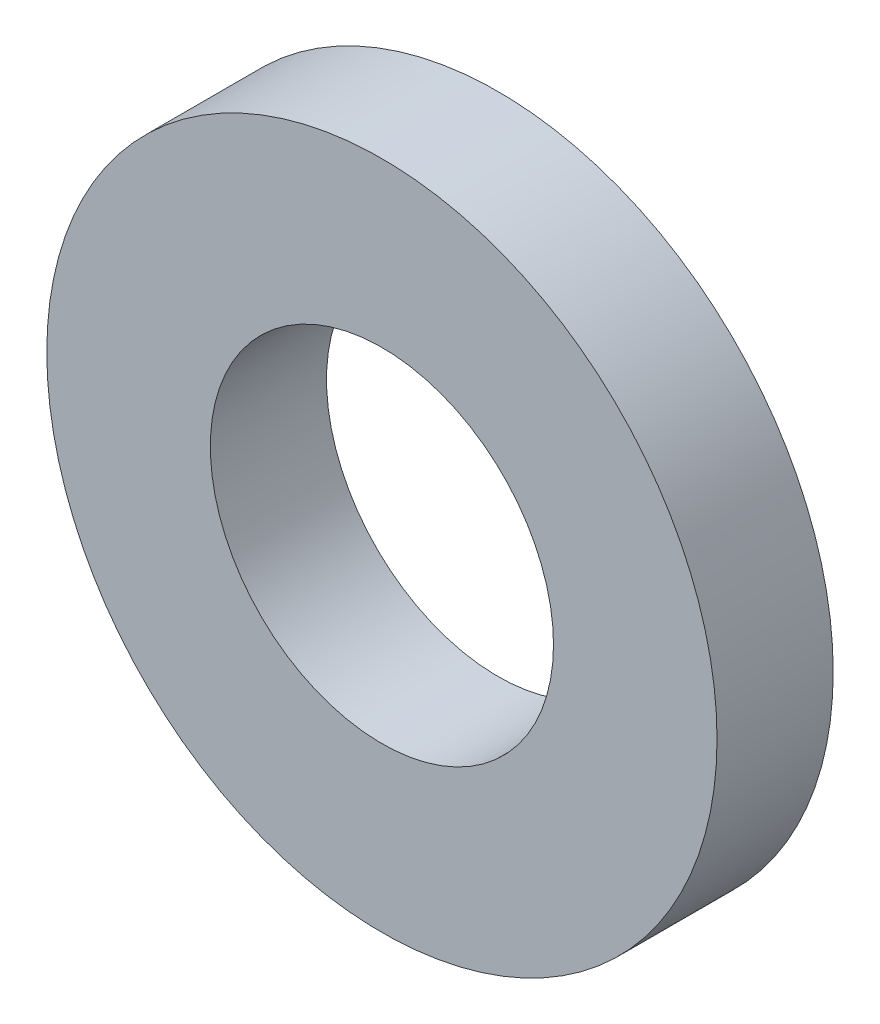
ISO-10303-21;
HEADER;
FILE_DESCRIPTION(('STEP AP214'),'2;1');
FILE_NAME('part.step','',(''),(''),'','','');
FILE_SCHEMA(('AUTOMOTIVE_DESIGN { 1 0 10303 214 1 1 1 1 }'));
ENDSEC;
DATA;
#1=APPLICATION_CONTEXT('core data for automotive mechanical design processes');
#2=APPLICATION_PROTOCOL_DEFINITION('international standard','automotive_design',2000,#1);
#3=PRODUCT_CONTEXT('',#1,'mechanical');
#4=PRODUCT('Part','Part','',(#3));
#5=PRODUCT_RELATED_PRODUCT_CATEGORY('part','',(#4));
#6=PRODUCT_DEFINITION_FORMATION('','',#4);
#7=PRODUCT_DEFINITION_CONTEXT('part definition',#1,'design');
#8=PRODUCT_DEFINITION('design','',#6,#7);
#9=PRODUCT_DEFINITION_SHAPE('','',#8);
#10=(LENGTH_UNIT() NAMED_UNIT(*) SI_UNIT(.MILLI.,.METRE.));
#11=(NAMED_UNIT(*) PLANE_ANGLE_UNIT() SI_UNIT($,.RADIAN.));
#12=(NAMED_UNIT(*) SI_UNIT($,.STERADIAN.) SOLID_ANGLE_UNIT());
#13=UNCERTAINTY_MEASURE_WITH_UNIT(LENGTH_MEASURE(1.E-05),#10,'distance_accuracy_value','');
#14=(GEOMETRIC_REPRESENTATION_CONTEXT(3) GLOBAL_UNCERTAINTY_ASSIGNED_CONTEXT((#13)) GLOBAL_UNIT_ASSIGNED_CONTEXT((#10,
#11,#12)) REPRESENTATION_CONTEXT('',''));
#15=CARTESIAN_POINT('',(0.,0.,0.));
#16=DIRECTION('',(0.,0.,1.));
#17=DIRECTION('',(1.,0.,0.));
#18=AXIS2_PLACEMENT_3D('',#15,#16,#17);
#19=CARTESIAN_POINT('',(0.,0.,-1.651));
#20=DIRECTION('',(0.,0.,1.));
#21=DIRECTION('',(1.,0.,0.));
#22=AXIS2_PLACEMENT_3D('',#19,#20,#21);
#23=CYLINDRICAL_SURFACE('',#22,4.7625);
#24=CARTESIAN_POINT('',(0.,0.,-1.651));
#25=DIRECTION('',(0.,0.,1.));
#26=DIRECTION('',(1.,0.,0.));
#27=AXIS2_PLACEMENT_3D('',#24,#25,#26);
#28=CIRCLE('',#27,4.7625);
#29=CARTESIAN_POINT('',(4.7625,0.,-1.651));
#30=VERTEX_POINT('',#29);
#31=EDGE_CURVE('E10',#30,#30,#28,.T.);
#32=CARTESIAN_POINT('',(0.,0.,0.));
#33=DIRECTION('',(0.,0.,1.));
#34=DIRECTION('',(1.,0.,0.));
#35=AXIS2_PLACEMENT_3D('',#32,#33,#34);
#36=CIRCLE('',#35,4.7625);
#37=CARTESIAN_POINT('',(4.7625,0.,0.));
#38=VERTEX_POINT('',#37);
#39=EDGE_CURVE('E36',#38,#38,#36,.T.);
#40=CARTESIAN_POINT('',(4.7625,0.,-1.651));
#41=CARTESIAN_POINT('',(4.7625,0.,-1.63380208333333));
#42=CARTESIAN_POINT('',(4.7625,0.,-1.61660416666667));
#43=CARTESIAN_POINT('',(4.7625,0.,-1.58220833333333));
#44=CARTESIAN_POINT('',(4.7625,0.,-1.56501041666667));
#45=CARTESIAN_POINT('',(4.7625,0.,-1.53061458333333));
#46=CARTESIAN_POINT('',(4.7625,0.,-1.51341666666667));
#47=CARTESIAN_POINT('',(4.7625,0.,-1.47902083333333));
#48=CARTESIAN_POINT('',(4.7625,0.,-1.46182291666667));
#49=CARTESIAN_POINT('',(4.7625,0.,-1.42742708333333));
#50=CARTESIAN_POINT('',(4.7625,0.,-1.41022916666667));
#51=CARTESIAN_POINT('',(4.7625,0.,-1.37583333333333));
#52=CARTESIAN_POINT('',(4.7625,0.,-1.35863541666667));
#53=CARTESIAN_POINT('',(4.7625,0.,-1.32423958333333));
#54=CARTESIAN_POINT('',(4.7625,0.,-1.30704166666667));
#55=CARTESIAN_POINT('',(4.7625,0.,-1.27264583333333));
#56=CARTESIAN_POINT('',(4.7625,0.,-1.25544791666667));
#57=CARTESIAN_POINT('',(4.7625,0.,-1.22105208333333));
#58=CARTESIAN_POINT('',(4.7625,0.,-1.20385416666667));
#59=CARTESIAN_POINT('',(4.7625,0.,-1.16945833333333));
#60=CARTESIAN_POINT('',(4.7625,0.,-1.15226041666667));
#61=CARTESIAN_POINT('',(4.7625,0.,-1.11786458333333));
#62=CARTESIAN_POINT('',(4.7625,0.,-1.10066666666667));
#63=CARTESIAN_POINT('',(4.7625,0.,-1.06627083333333));
#64=CARTESIAN_POINT('',(4.7625,0.,-1.04907291666667));
#65=CARTESIAN_POINT('',(4.7625,0.,-1.01467708333333));
#66=CARTESIAN_POINT('',(4.7625,0.,-0.997479166666667));
#67=CARTESIAN_POINT('',(4.7625,0.,-0.963083333333333));
#68=CARTESIAN_POINT('',(4.7625,0.,-0.945885416666667));
#69=CARTESIAN_POINT('',(4.7625,0.,-0.911489583333333));
#70=CARTESIAN_POINT('',(4.7625,0.,-0.894291666666667));
#71=CARTESIAN_POINT('',(4.7625,0.,-0.859895833333333));
#72=CARTESIAN_POINT('',(4.7625,0.,-0.842697916666667));
#73=CARTESIAN_POINT('',(4.7625,0.,-0.808302083333333));
#74=CARTESIAN_POINT('',(4.7625,0.,-0.791104166666667));
#75=CARTESIAN_POINT('',(4.7625,0.,-0.756708333333333));
#76=CARTESIAN_POINT('',(4.7625,0.,-0.739510416666667));
#77=CARTESIAN_POINT('',(4.7625,0.,-0.705114583333333));
#78=CARTESIAN_POINT('',(4.7625,0.,-0.687916666666667));
#79=CARTESIAN_POINT('',(4.7625,0.,-0.653520833333333));
#80=CARTESIAN_POINT('',(4.7625,0.,-0.636322916666667));
#81=CARTESIAN_POINT('',(4.7625,0.,-0.601927083333333));
#82=CARTESIAN_POINT('',(4.7625,0.,-0.584729166666667));
#83=CARTESIAN_POINT('',(4.7625,0.,-0.550333333333333));
#84=CARTESIAN_POINT('',(4.7625,0.,-0.533135416666667));
#85=CARTESIAN_POINT('',(4.7625,0.,-0.498739583333333));
#86=CARTESIAN_POINT('',(4.7625,0.,-0.481541666666667));
#87=CARTESIAN_POINT('',(4.7625,0.,-0.447145833333333));
#88=CARTESIAN_POINT('',(4.7625,0.,-0.429947916666667));
#89=CARTESIAN_POINT('',(4.7625,0.,-0.395552083333333));
#90=CARTESIAN_POINT('',(4.7625,0.,-0.378354166666667));
#91=CARTESIAN_POINT('',(4.7625,0.,-0.343958333333333));
#92=CARTESIAN_POINT('',(4.7625,0.,-0.326760416666667));
#93=CARTESIAN_POINT('',(4.7625,0.,-0.292364583333333));
#94=CARTESIAN_POINT('',(4.7625,0.,-0.275166666666667));
#95=CARTESIAN_POINT('',(4.7625,0.,-0.240770833333333));
#96=CARTESIAN_POINT('',(4.7625,0.,-0.223572916666667));
#97=CARTESIAN_POINT('',(4.7625,0.,-0.189177083333333));
#98=CARTESIAN_POINT('',(4.7625,0.,-0.171979166666667));
#99=CARTESIAN_POINT('',(4.7625,0.,-0.137583333333333));
#100=CARTESIAN_POINT('',(4.7625,0.,-0.120385416666667));
#101=CARTESIAN_POINT('',(4.7625,0.,-0.0859895833333333));
#102=CARTESIAN_POINT('',(4.7625,0.,-0.0687916666666667));
#103=CARTESIAN_POINT('',(4.7625,0.,-0.0343958333333333));
#104=CARTESIAN_POINT('',(4.7625,0.,-0.0171979166666666));
#105=CARTESIAN_POINT('',(4.7625,0.,0.));
#106=B_SPLINE_CURVE_WITH_KNOTS('',3,(#40,#41,#42,#43,#44,#45,#46,#47,#48,#49,#50,#51,#52,#53,
#54,#55,#56,#57,#58,#59,#60,#61,#62,#63,#64,#65,#66,#67,#68,#69,#70,#71,#72,#73,#74,#75,#76,#77,
#78,#79,#80,#81,#82,#83,#84,#85,#86,#87,#88,#89,#90,#91,#92,#93,#94,#95,#96,#97,#98,#99,#100,
#101,#102,#103,#104,#105),.UNSPECIFIED.,.F.,.F.,(4,2,2,2,2,2,2,2,2,2,2,2,2,2,2,2,2,2,2,2,2,2,2,
2,2,2,2,2,2,2,2,2,4),(0.,0.05159375,0.1031875,0.15478125,0.206375,0.25796875,0.3095625,
0.36115625,0.41275,0.46434375,0.5159375,0.56753125,0.619125,0.67071875,0.7223125,0.77390625,
0.8255,0.87709375,0.9286875,0.98028125,1.031875,1.08346875,1.1350625,1.18665625,1.23825,
1.28984375,1.3414375,1.39303125,1.444625,1.49621875,1.5478125,1.59940625,1.651),.UNSPECIFIED.);
#107=EDGE_CURVE('BSEAM33',#30,#38,#106,.T.);
#108=ORIENTED_EDGE('',*,*,#31,.T.);
#109=ORIENTED_EDGE('',*,*,#39,.F.);
#110=ORIENTED_EDGE('',*,*,#107,.T.);
#111=ORIENTED_EDGE('',*,*,#107,.F.);
#112=EDGE_LOOP('',(#108,#110,#109,#111));
#113=FACE_BOUND('',#112,.T.);
#114=ADVANCED_FACE('F33',(#113),#23,.T.);
#115=CARTESIAN_POINT('',(0.,0.,-1.651));
#116=DIRECTION('',(0.,0.,1.));
#117=DIRECTION('',(1.,0.,0.));
#118=AXIS2_PLACEMENT_3D('',#115,#116,#117);
#119=PLANE('',#118);
#120=CARTESIAN_POINT('',(0.,0.,-1.651));
#121=DIRECTION('',(0.,0.,1.));
#122=DIRECTION('',(1.,0.,0.));
#123=AXIS2_PLACEMENT_3D('',#120,#121,#122);
#124=CIRCLE('',#123,2.4384);
#125=CARTESIAN_POINT('',(2.4384,0.,-1.651));
#126=VERTEX_POINT('',#125);
#127=EDGE_CURVE('E43',#126,#126,#124,.T.);
#128=ORIENTED_EDGE('',*,*,#127,.T.);
#129=EDGE_LOOP('',(#128));
#130=FACE_BOUND('',#129,.T.);
#131=ORIENTED_EDGE('',*,*,#31,.F.);
#132=EDGE_LOOP('',(#131));
#133=FACE_BOUND('',#132,.T.);
#134=ADVANCED_FACE('F51',(#130,#133),#119,.F.);
#135=CARTESIAN_POINT('',(0.,0.,0.));
#136=DIRECTION('',(0.,0.,1.));
#137=DIRECTION('',(1.,0.,0.));
#138=AXIS2_PLACEMENT_3D('',#135,#136,#137);
#139=PLANE('',#138);
#140=CARTESIAN_POINT('',(0.,0.,0.));
#141=DIRECTION('',(0.,0.,1.));
#142=DIRECTION('',(1.,0.,0.));
#143=AXIS2_PLACEMENT_3D('',#140,#141,#142);
#144=CIRCLE('',#143,2.4384);
#145=CARTESIAN_POINT('',(2.4384,0.,0.));
#146=VERTEX_POINT('',#145);
#147=EDGE_CURVE('E45',#146,#146,#144,.T.);
#148=ORIENTED_EDGE('',*,*,#147,.F.);
#149=EDGE_LOOP('',(#148));
#150=FACE_BOUND('',#149,.T.);
#151=ORIENTED_EDGE('',*,*,#39,.T.);
#152=EDGE_LOOP('',(#151));
#153=FACE_BOUND('',#152,.T.);
#154=ADVANCED_FACE('F57',(#150,#153),#139,.T.);
#155=CARTESIAN_POINT('',(0.,0.,-1.651));
#156=DIRECTION('',(0.,0.,1.));
#157=DIRECTION('',(1.,0.,0.));
#158=AXIS2_PLACEMENT_3D('',#155,#156,#157);
#159=CYLINDRICAL_SURFACE('',#158,2.4384);
#160=CARTESIAN_POINT('',(2.4384,0.,-1.651));
#161=CARTESIAN_POINT('',(2.4384,0.,-1.63380208333333));
#162=CARTESIAN_POINT('',(2.4384,0.,-1.61660416666667));
#163=CARTESIAN_POINT('',(2.4384,0.,-1.58220833333333));
#164=CARTESIAN_POINT('',(2.4384,0.,-1.56501041666667));
#165=CARTESIAN_POINT('',(2.4384,0.,-1.53061458333333));
#166=CARTESIAN_POINT('',(2.4384,0.,-1.51341666666667));
#167=CARTESIAN_POINT('',(2.4384,0.,-1.47902083333333));
#168=CARTESIAN_POINT('',(2.4384,0.,-1.46182291666667));
#169=CARTESIAN_POINT('',(2.4384,0.,-1.42742708333333));
#170=CARTESIAN_POINT('',(2.4384,0.,-1.41022916666667));
#171=CARTESIAN_POINT('',(2.4384,0.,-1.37583333333333));
#172=CARTESIAN_POINT('',(2.4384,0.,-1.35863541666667));
#173=CARTESIAN_POINT('',(2.4384,0.,-1.32423958333333));
#174=CARTESIAN_POINT('',(2.4384,0.,-1.30704166666667));
#175=CARTESIAN_POINT('',(2.4384,0.,-1.27264583333333));
#176=CARTESIAN_POINT('',(2.4384,0.,-1.25544791666667));
#177=CARTESIAN_POINT('',(2.4384,0.,-1.22105208333333));
#178=CARTESIAN_POINT('',(2.4384,0.,-1.20385416666667));
#179=CARTESIAN_POINT('',(2.4384,0.,-1.16945833333333));
#180=CARTESIAN_POINT('',(2.4384,0.,-1.15226041666667));
#181=CARTESIAN_POINT('',(2.4384,0.,-1.11786458333333));
#182=CARTESIAN_POINT('',(2.4384,0.,-1.10066666666667));
#183=CARTESIAN_POINT('',(2.4384,0.,-1.06627083333333));
#184=CARTESIAN_POINT('',(2.4384,0.,-1.04907291666667));
#185=CARTESIAN_POINT('',(2.4384,0.,-1.01467708333333));
#186=CARTESIAN_POINT('',(2.4384,0.,-0.997479166666667));
#187=CARTESIAN_POINT('',(2.4384,0.,-0.963083333333333));
#188=CARTESIAN_POINT('',(2.4384,0.,-0.945885416666667));
#189=CARTESIAN_POINT('',(2.4384,0.,-0.911489583333333));
#190=CARTESIAN_POINT('',(2.4384,0.,-0.894291666666667));
#191=CARTESIAN_POINT('',(2.4384,0.,-0.859895833333333));
#192=CARTESIAN_POINT('',(2.4384,0.,-0.842697916666667));
#193=CARTESIAN_POINT('',(2.4384,0.,-0.808302083333333));
#194=CARTESIAN_POINT('',(2.4384,0.,-0.791104166666667));
#195=CARTESIAN_POINT('',(2.4384,0.,-0.756708333333333));
#196=CARTESIAN_POINT('',(2.4384,0.,-0.739510416666667));
#197=CARTESIAN_POINT('',(2.4384,0.,-0.705114583333333));
#198=CARTESIAN_POINT('',(2.4384,0.,-0.687916666666667));
#199=CARTESIAN_POINT('',(2.4384,0.,-0.653520833333333));
#200=CARTESIAN_POINT('',(2.4384,0.,-0.636322916666667));
#201=CARTESIAN_POINT('',(2.4384,0.,-0.601927083333333));
#202=CARTESIAN_POINT('',(2.4384,0.,-0.584729166666667));
#203=CARTESIAN_POINT('',(2.4384,0.,-0.550333333333333));
#204=CARTESIAN_POINT('',(2.4384,0.,-0.533135416666667));
#205=CARTESIAN_POINT('',(2.4384,0.,-0.498739583333333));
#206=CARTESIAN_POINT('',(2.4384,0.,-0.481541666666667));
#207=CARTESIAN_POINT('',(2.4384,0.,-0.447145833333333));
#208=CARTESIAN_POINT('',(2.4384,0.,-0.429947916666667));
#209=CARTESIAN_POINT('',(2.4384,0.,-0.395552083333333));
#210=CARTESIAN_POINT('',(2.4384,0.,-0.378354166666667));
#211=CARTESIAN_POINT('',(2.4384,0.,-0.343958333333333));
#212=CARTESIAN_POINT('',(2.4384,0.,-0.326760416666667));
#213=CARTESIAN_POINT('',(2.4384,0.,-0.292364583333333));
#214=CARTESIAN_POINT('',(2.4384,0.,-0.275166666666667));
#215=CARTESIAN_POINT('',(2.4384,0.,-0.240770833333333));
#216=CARTESIAN_POINT('',(2.4384,0.,-0.223572916666667));
#217=CARTESIAN_POINT('',(2.4384,0.,-0.189177083333333));
#218=CARTESIAN_POINT('',(2.4384,0.,-0.171979166666667));
#219=CARTESIAN_POINT('',(2.4384,0.,-0.137583333333333));
#220=CARTESIAN_POINT('',(2.4384,0.,-0.120385416666667));
#221=CARTESIAN_POINT('',(2.4384,0.,-0.0859895833333333));
#222=CARTESIAN_POINT('',(2.4384,0.,-0.0687916666666667));
#223=CARTESIAN_POINT('',(2.4384,0.,-0.0343958333333333));
#224=CARTESIAN_POINT('',(2.4384,0.,-0.0171979166666666));
#225=CARTESIAN_POINT('',(2.4384,0.,0.));
#226=B_SPLINE_CURVE_WITH_KNOTS('',3,(#160,#161,#162,#163,#164,#165,#166,#167,#168,#169,#170,
#171,#172,#173,#174,#175,#176,#177,#178,#179,#180,#181,#182,#183,#184,#185,#186,#187,#188,#189,
#190,#191,#192,#193,#194,#195,#196,#197,#198,#199,#200,#201,#202,#203,#204,#205,#206,#207,#208,
#209,#210,#211,#212,#213,#214,#215,#216,#217,#218,#219,#220,#221,#222,#223,#224,#225),
.UNSPECIFIED.,.F.,.F.,(4,2,2,2,2,2,2,2,2,2,2,2,2,2,2,2,2,2,2,2,2,2,2,2,2,2,2,2,2,2,2,2,4),(0.,
0.05159375,0.1031875,0.15478125,0.206375,0.25796875,0.3095625,0.36115625,0.41275,0.46434375,
0.5159375,0.56753125,0.619125,0.67071875,0.7223125,0.77390625,0.8255,0.87709375,0.9286875,
0.98028125,1.031875,1.08346875,1.1350625,1.18665625,1.23825,1.28984375,1.3414375,1.39303125,
1.444625,1.49621875,1.5478125,1.59940625,1.651),.UNSPECIFIED.);
#227=EDGE_CURVE('BSEAM54',#126,#146,#226,.T.);
#228=ORIENTED_EDGE('',*,*,#127,.F.);
#229=ORIENTED_EDGE('',*,*,#147,.T.);
#230=ORIENTED_EDGE('',*,*,#227,.T.);
#231=ORIENTED_EDGE('',*,*,#227,.F.);
#232=EDGE_LOOP('',(#228,#230,#229,#231));
#233=FACE_BOUND('',#232,.T.);
#234=ADVANCED_FACE('F54',(#233),#159,.F.);
#235=CLOSED_SHELL('',(#114,#134,#154,#234));
#236=MANIFOLD_SOLID_BREP('B2',#235);
#237=ADVANCED_BREP_SHAPE_REPRESENTATION('',(#18,#236),#14);
#238=SHAPE_DEFINITION_REPRESENTATION(#9,#237);
ENDSEC;
END-ISO-10303-21;
